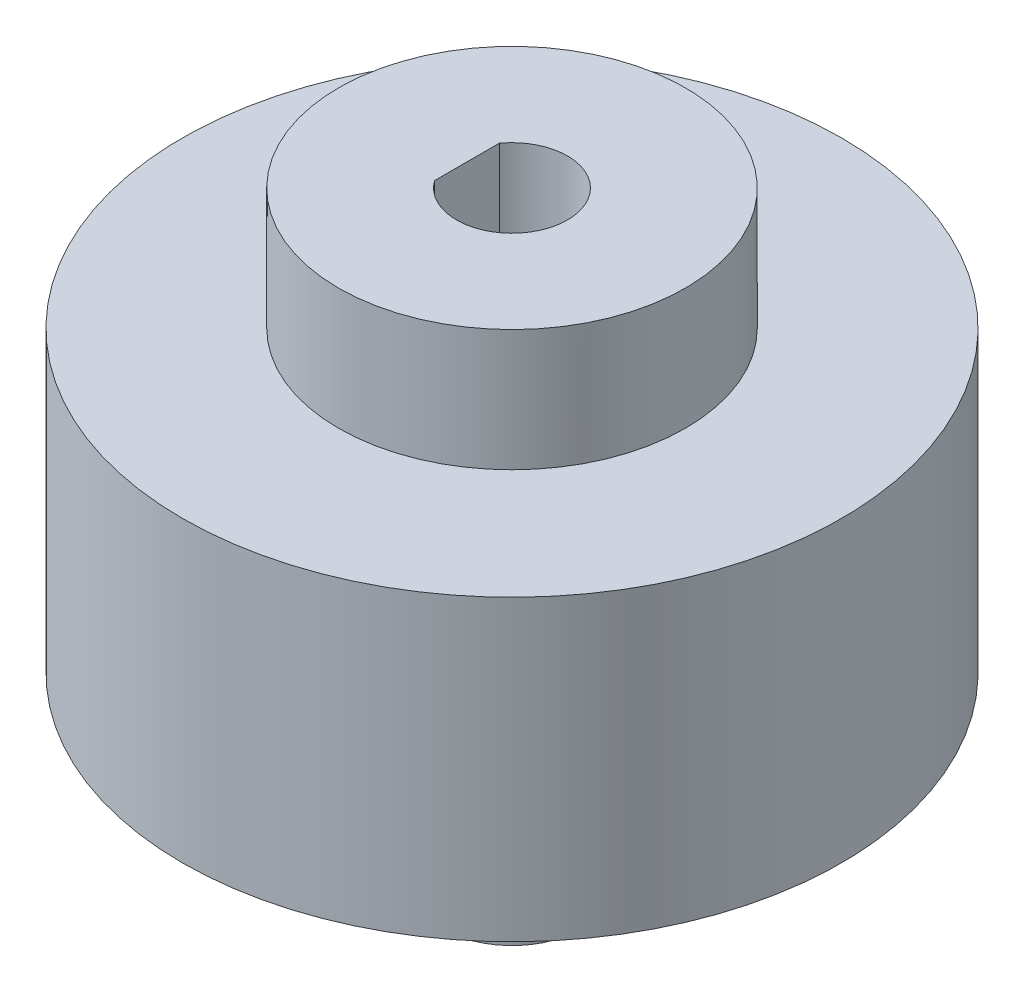
ISO-10303-21;
HEADER;
FILE_DESCRIPTION(('STEP AP214'),'2;1');
FILE_NAME('part.step','',(''),(''),'','','');
FILE_SCHEMA(('AUTOMOTIVE_DESIGN { 1 0 10303 214 1 1 1 1 }'));
ENDSEC;
DATA;
#1=APPLICATION_CONTEXT('core data for automotive mechanical design processes');
#2=APPLICATION_PROTOCOL_DEFINITION('international standard','automotive_design',2000,#1);
#3=PRODUCT_CONTEXT('',#1,'mechanical');
#4=PRODUCT('Part','Part','',(#3));
#5=PRODUCT_RELATED_PRODUCT_CATEGORY('part','',(#4));
#6=PRODUCT_DEFINITION_FORMATION('','',#4);
#7=PRODUCT_DEFINITION_CONTEXT('part definition',#1,'design');
#8=PRODUCT_DEFINITION('design','',#6,#7);
#9=PRODUCT_DEFINITION_SHAPE('','',#8);
#10=(LENGTH_UNIT() NAMED_UNIT(*) SI_UNIT(.MILLI.,.METRE.));
#11=(NAMED_UNIT(*) PLANE_ANGLE_UNIT() SI_UNIT($,.RADIAN.));
#12=(NAMED_UNIT(*) SI_UNIT($,.STERADIAN.) SOLID_ANGLE_UNIT());
#13=UNCERTAINTY_MEASURE_WITH_UNIT(LENGTH_MEASURE(1.E-05),#10,'distance_accuracy_value','');
#14=(GEOMETRIC_REPRESENTATION_CONTEXT(3) GLOBAL_UNCERTAINTY_ASSIGNED_CONTEXT((#13)) GLOBAL_UNIT_ASSIGNED_CONTEXT((#10,
#11,#12)) REPRESENTATION_CONTEXT('',''));
#15=CARTESIAN_POINT('',(0.,0.,0.));
#16=DIRECTION('',(0.,0.,1.));
#17=DIRECTION('',(1.,0.,0.));
#18=AXIS2_PLACEMENT_3D('',#15,#16,#17);
#19=CARTESIAN_POINT('',(0.,0.,0.));
#20=DIRECTION('',(0.,1.,0.));
#21=DIRECTION('',(0.,0.,1.));
#22=AXIS2_PLACEMENT_3D('',#19,#20,#21);
#23=PLANE('',#22);
#24=CARTESIAN_POINT('',(0.,0.,0.));
#25=DIRECTION('',(0.,1.,0.));
#26=DIRECTION('',(0.,0.,1.));
#27=AXIS2_PLACEMENT_3D('',#24,#25,#26);
#28=CIRCLE('',#27,3.2);
#29=CARTESIAN_POINT('',(-2.6,0.,1.86547581061776));
#30=VERTEX_POINT('',#29);
#31=CARTESIAN_POINT('',(-2.6,0.,-1.86547581061776));
#32=VERTEX_POINT('',#31);
#33=EDGE_CURVE('E71',#30,#32,#28,.T.);
#34=ORIENTED_EDGE('',*,*,#33,.F.);
#35=DIRECTION('',(0.,0.,1.));
#36=VECTOR('',#35,1.);
#37=CARTESIAN_POINT('',(-2.6,0.,0.));
#38=LINE('',#37,#36);
#39=EDGE_CURVE('E92',#32,#30,#38,.T.);
#40=ORIENTED_EDGE('',*,*,#39,.F.);
#41=EDGE_LOOP('',(#34,#40));
#42=FACE_BOUND('',#41,.T.);
#43=CARTESIAN_POINT('',(0.,0.,0.));
#44=DIRECTION('',(0.,1.,0.));
#45=DIRECTION('',(0.,0.,1.));
#46=AXIS2_PLACEMENT_3D('',#43,#44,#45);
#47=CIRCLE('',#46,10.);
#48=CARTESIAN_POINT('',(0.,0.,10.));
#49=VERTEX_POINT('',#48);
#50=EDGE_CURVE('E93',#49,#49,#47,.T.);
#51=ORIENTED_EDGE('',*,*,#50,.T.);
#52=EDGE_LOOP('',(#51));
#53=FACE_BOUND('',#52,.T.);
#54=ADVANCED_FACE('F47',(#42,#53),#23,.T.);
#55=CARTESIAN_POINT('',(0.,-13.,0.));
#56=DIRECTION('',(0.,1.,0.));
#57=DIRECTION('',(0.,0.,1.));
#58=AXIS2_PLACEMENT_3D('',#55,#56,#57);
#59=CYLINDRICAL_SURFACE('',#58,3.2);
#60=ORIENTED_EDGE('',*,*,#33,.T.);
#61=DIRECTION('',(0.,-1.,0.));
#62=VECTOR('',#61,1.);
#63=CARTESIAN_POINT('',(-2.6,0.,-1.86547581061776));
#64=LINE('',#63,#62);
#65=CARTESIAN_POINT('',(-2.6,-13.,-1.86547581061776));
#66=VERTEX_POINT('',#65);
#67=EDGE_CURVE('E85',#32,#66,#64,.T.);
#68=ORIENTED_EDGE('',*,*,#67,.T.);
#69=CARTESIAN_POINT('',(0.,-13.,0.));
#70=DIRECTION('',(0.,1.,0.));
#71=DIRECTION('',(0.,0.,1.));
#72=AXIS2_PLACEMENT_3D('',#69,#70,#71);
#73=CIRCLE('',#72,3.2);
#74=CARTESIAN_POINT('',(-2.6,-13.,1.86547581061776));
#75=VERTEX_POINT('',#74);
#76=EDGE_CURVE('E79',#75,#66,#73,.T.);
#77=ORIENTED_EDGE('',*,*,#76,.F.);
#78=DIRECTION('',(0.,-1.,0.));
#79=VECTOR('',#78,1.);
#80=CARTESIAN_POINT('',(-2.6,0.,1.86547581061776));
#81=LINE('',#80,#79);
#82=EDGE_CURVE('E67',#30,#75,#81,.T.);
#83=ORIENTED_EDGE('',*,*,#82,.F.);
#84=EDGE_LOOP('',(#60,#68,#77,#83));
#85=FACE_BOUND('',#84,.T.);
#86=ADVANCED_FACE('F86',(#85),#59,.F.);
#87=CARTESIAN_POINT('',(0.,-13.,0.));
#88=DIRECTION('',(0.,1.,0.));
#89=DIRECTION('',(0.,0.,1.));
#90=AXIS2_PLACEMENT_3D('',#87,#88,#89);
#91=PLANE('',#90);
#92=DIRECTION('',(0.,0.,1.));
#93=VECTOR('',#92,1.);
#94=CARTESIAN_POINT('',(-2.6,-13.,0.));
#95=LINE('',#94,#93);
#96=EDGE_CURVE('E82',#66,#75,#95,.T.);
#97=ORIENTED_EDGE('',*,*,#96,.T.);
#98=ORIENTED_EDGE('',*,*,#76,.T.);
#99=EDGE_LOOP('',(#97,#98));
#100=FACE_BOUND('',#99,.T.);
#101=ADVANCED_FACE('F80',(#100),#91,.T.);
#102=CARTESIAN_POINT('',(-2.6,0.,0.));
#103=DIRECTION('',(1.,0.,0.));
#104=DIRECTION('',(0.,0.,-1.));
#105=AXIS2_PLACEMENT_3D('',#102,#103,#104);
#106=PLANE('',#105);
#107=ORIENTED_EDGE('',*,*,#96,.F.);
#108=ORIENTED_EDGE('',*,*,#67,.F.);
#109=ORIENTED_EDGE('',*,*,#39,.T.);
#110=ORIENTED_EDGE('',*,*,#82,.T.);
#111=EDGE_LOOP('',(#107,#108,#109,#110));
#112=FACE_BOUND('',#111,.T.);
#113=ADVANCED_FACE('F91',(#112),#106,.T.);
#114=CARTESIAN_POINT('',(0.,-7.,0.));
#115=DIRECTION('',(0.,1.,0.));
#116=DIRECTION('',(0.,0.,1.));
#117=AXIS2_PLACEMENT_3D('',#114,#115,#116);
#118=CYLINDRICAL_SURFACE('',#117,10.);
#119=CARTESIAN_POINT('',(0.,-7.,0.));
#120=DIRECTION('',(0.,-1.,0.));
#121=DIRECTION('',(0.,0.,-1.));
#122=AXIS2_PLACEMENT_3D('',#119,#120,#121);
#123=CIRCLE('',#122,10.);
#124=CARTESIAN_POINT('',(0.,-7.,-10.));
#125=VERTEX_POINT('',#124);
#126=EDGE_CURVE('E97',#125,#125,#123,.F.);
#127=ORIENTED_EDGE('',*,*,#126,.T.);
#128=EDGE_LOOP('',(#127));
#129=FACE_BOUND('',#128,.T.);
#130=ORIENTED_EDGE('',*,*,#50,.F.);
#131=EDGE_LOOP('',(#130));
#132=FACE_BOUND('',#131,.T.);
#133=ADVANCED_FACE('F133',(#129,#132),#118,.T.);
#134=CARTESIAN_POINT('',(0.,-7.,0.));
#135=DIRECTION('',(0.,-1.,0.));
#136=DIRECTION('',(0.,0.,-1.));
#137=AXIS2_PLACEMENT_3D('',#134,#135,#136);
#138=PLANE('',#137);
#139=ORIENTED_EDGE('',*,*,#126,.F.);
#140=EDGE_LOOP('',(#139));
#141=FACE_BOUND('',#140,.T.);
#142=CARTESIAN_POINT('',(0.,-7.,0.));
#143=DIRECTION('',(0.,-1.,0.));
#144=DIRECTION('',(0.,0.,-1.));
#145=AXIS2_PLACEMENT_3D('',#142,#143,#144);
#146=CIRCLE('',#145,19.);
#147=CARTESIAN_POINT('',(0.,-7.,-19.));
#148=VERTEX_POINT('',#147);
#149=EDGE_CURVE('E238',#148,#148,#146,.T.);
#150=ORIENTED_EDGE('',*,*,#149,.F.);
#151=EDGE_LOOP('',(#150));
#152=FACE_BOUND('',#151,.T.);
#153=ADVANCED_FACE('F134',(#141,#152),#138,.F.);
#154=CARTESIAN_POINT('',(0.,-24.2,0.));
#155=DIRECTION('',(0.,1.,0.));
#156=DIRECTION('',(0.,0.,1.));
#157=AXIS2_PLACEMENT_3D('',#154,#155,#156);
#158=CYLINDRICAL_SURFACE('',#157,16.2);
#159=CARTESIAN_POINT('',(-3.,-16.6,-15.9197989937059));
#160=CARTESIAN_POINT('',(-2.99999355747732,-16.7669537954407,-15.9198022047369));
#161=CARTESIAN_POINT('',(-2.9860159403156,-16.9339916237496,-15.9224538186141));
#162=CARTESIAN_POINT('',(-2.93051090682567,-17.2633599348253,-15.9327609823407));
#163=CARTESIAN_POINT('',(-2.88895988265398,-17.4256862592773,-15.9404208200563));
#164=CARTESIAN_POINT('',(-2.77962553001961,-17.7408181148807,-15.9598478223478));
#165=CARTESIAN_POINT('',(-2.71186634334625,-17.8936322582694,-15.971611205945));
#166=CARTESIAN_POINT('',(-2.55210262533196,-18.1857132742647,-15.9979153890088));
#167=CARTESIAN_POINT('',(-2.46010008275877,-18.324981256828,-16.0124559606261));
#168=CARTESIAN_POINT('',(-2.25327039315579,-18.5877188368911,-16.0428733837621));
#169=CARTESIAN_POINT('',(-2.13820580886466,-18.7110000655336,-16.0587630525941));
#170=CARTESIAN_POINT('',(-1.88903146064627,-18.93662401653,-16.0899750250605));
#171=CARTESIAN_POINT('',(-1.75492046198647,-19.0389653803529,-16.1052972918304));
#172=CARTESIAN_POINT('',(-1.4702248351875,-19.2205246437418,-16.1337851773818));
#173=CARTESIAN_POINT('',(-1.31952527884798,-19.299565200722,-16.1469339374821));
#174=CARTESIAN_POINT('',(-1.00670212397873,-19.4311369311341,-16.1694499270784));
#175=CARTESIAN_POINT('',(-0.844579442799549,-19.4836702305107,-16.1788174598255));
#176=CARTESIAN_POINT('',(-0.515463476206911,-19.5601544567536,-16.1926250018502));
#177=CARTESIAN_POINT('',(-0.348546292760662,-19.5844228196304,-16.1971196962324));
#178=CARTESIAN_POINT('',(-0.0129530091873489,-19.6046771340743,-16.2008635474312));
#179=CARTESIAN_POINT('',(0.15572294351926,-19.6006654373535,-16.2001131404198));
#180=CARTESIAN_POINT('',(0.487869494205325,-19.5647174400773,-16.1934941386404));
#181=CARTESIAN_POINT('',(0.651378511237082,-19.5331229184591,-16.1876881894092));
#182=CARTESIAN_POINT('',(0.970733360599348,-19.4434463986606,-16.1716806715516));
#183=CARTESIAN_POINT('',(1.12657891852558,-19.3853634527775,-16.1614789456539));
#184=CARTESIAN_POINT('',(1.42717724925516,-19.2440315684291,-16.1377212053041));
#185=CARTESIAN_POINT('',(1.5718640580683,-19.1606455157664,-16.1241469902955));
#186=CARTESIAN_POINT('',(1.84531934837263,-18.9711754023029,-16.0951462604918));
#187=CARTESIAN_POINT('',(1.97408624729708,-18.8650890877718,-16.0797195618451));
#188=CARTESIAN_POINT('',(2.21407087919419,-18.6313450130219,-16.0484510047805));
#189=CARTESIAN_POINT('',(2.32499724063475,-18.5033882709861,-16.0326063881307));
#190=CARTESIAN_POINT('',(2.52385845031203,-18.2305328498616,-16.0025086968305));
#191=CARTESIAN_POINT('',(2.61179297824006,-18.0856339347853,-15.9882556443545));
#192=CARTESIAN_POINT('',(2.76225442089834,-17.7826266622488,-15.9629511350764));
#193=CARTESIAN_POINT('',(2.82473984161988,-17.6244972347435,-15.9519049152727));
#194=CARTESIAN_POINT('',(2.92217464781018,-17.2997341455501,-15.9343456311629));
#195=CARTESIAN_POINT('',(2.95712707088969,-17.1331014241587,-15.9278320667955));
#196=CARTESIAN_POINT('',(2.9980800657247,-16.7986868874172,-15.9201742741413));
#197=CARTESIAN_POINT('',(3.00449886903996,-16.630958013053,-15.918952488489));
#198=CARTESIAN_POINT('',(2.98932276964418,-16.2968248606094,-15.9218091582748));
#199=CARTESIAN_POINT('',(2.96772921649287,-16.1304205191061,-15.9258873583738));
#200=CARTESIAN_POINT('',(2.89750012628756,-15.8050295704116,-15.9388123131555));
#201=CARTESIAN_POINT('',(2.84908309661402,-15.6459941342812,-15.9476205190484));
#202=CARTESIAN_POINT('',(2.72681296691701,-15.3382930933951,-15.9689799127053));
#203=CARTESIAN_POINT('',(2.65295803241663,-15.1896282374531,-15.9815313704085));
#204=CARTESIAN_POINT('',(2.48094312589812,-14.9050436990069,-16.0091400700798));
#205=CARTESIAN_POINT('',(2.38251850623505,-14.7692866154562,-16.0242239688788));
#206=CARTESIAN_POINT('',(2.16451574765841,-14.516064039491,-16.0551226501072));
#207=CARTESIAN_POINT('',(2.04493575553374,-14.3986001512572,-16.0709374964778));
#208=CARTESIAN_POINT('',(1.7861504735088,-14.1837399521935,-16.1017649123033));
#209=CARTESIAN_POINT('',(1.64671006657765,-14.0866246473447,-16.1167643649588));
#210=CARTESIAN_POINT('',(1.35324993181201,-13.9171998351857,-16.1440514960635));
#211=CARTESIAN_POINT('',(1.19923075581216,-13.8448893894423,-16.1563392770962));
#212=CARTESIAN_POINT('',(0.881768314841834,-13.7275495346492,-16.1767620863005));
#213=CARTESIAN_POINT('',(0.718377864102461,-13.6823810758063,-16.1849182466033));
#214=CARTESIAN_POINT('',(0.386164920605944,-13.6201630966287,-16.1962488917699));
#215=CARTESIAN_POINT('',(0.217342986574603,-13.6031106934207,-16.1994238873745));
#216=CARTESIAN_POINT('',(-0.118243847955961,-13.5977072270098,-16.2004246539452));
#217=CARTESIAN_POINT('',(-0.285001821916212,-13.6089313895025,-16.1983295931088));
#218=CARTESIAN_POINT('',(-0.614212379314872,-13.6588334650974,-16.1891898213401));
#219=CARTESIAN_POINT('',(-0.776665001852551,-13.6975111287904,-16.1821451553739));
#220=CARTESIAN_POINT('',(-1.0924361303629,-13.8010451047287,-16.163897275679));
#221=CARTESIAN_POINT('',(-1.24576954766951,-13.8658572525502,-16.1527010801366));
#222=CARTESIAN_POINT('',(-1.53944890492344,-14.0197699554816,-16.1273633278497));
#223=CARTESIAN_POINT('',(-1.67979400268325,-14.1088720841244,-16.1132215803029));
#224=CARTESIAN_POINT('',(-1.94563231644097,-14.3103027393416,-16.0833044463411));
#225=CARTESIAN_POINT('',(-2.07089038427323,-14.4229386559201,-16.0675089796049));
#226=CARTESIAN_POINT('',(-2.30087510017368,-14.6676007286439,-16.0361927783877));
#227=CARTESIAN_POINT('',(-2.40559691661042,-14.799631435116,-16.0206721093388));
#228=CARTESIAN_POINT('',(-2.59241894180908,-15.0807541512503,-15.9915105510339));
#229=CARTESIAN_POINT('',(-2.6743073360987,-15.229988860859,-15.9778878138466));
#230=CARTESIAN_POINT('',(-2.81172069671606,-15.5402999413813,-15.95428242778));
#231=CARTESIAN_POINT('',(-2.86727071914869,-15.701364888819,-15.9442963214236));
#232=CARTESIAN_POINT('',(-2.93904960531601,-15.9857699482044,-15.9311926935832));
#233=CARTESIAN_POINT('',(-2.96186712844396,-16.1074378444433,-15.9269452374235));
#234=CARTESIAN_POINT('',(-2.99234451439745,-16.3527218266351,-15.921247234703));
#235=CARTESIAN_POINT('',(-3.00000477195579,-16.4763378617692,-15.9197966153056));
#236=CARTESIAN_POINT('',(-3.,-16.6,-15.9197989937059));
#237=B_SPLINE_CURVE_WITH_KNOTS('',3,(#159,#160,#161,#162,#163,#164,#165,#166,#167,#168,#169,
#170,#171,#172,#173,#174,#175,#176,#177,#178,#179,#180,#181,#182,#183,#184,#185,#186,#187,#188,
#189,#190,#191,#192,#193,#194,#195,#196,#197,#198,#199,#200,#201,#202,#203,#204,#205,#206,#207,
#208,#209,#210,#211,#212,#213,#214,#215,#216,#217,#218,#219,#220,#221,#222,#223,#224,#225,#226,
#227,#228,#229,#230,#231,#232,#233,#234,#235,#236),.UNSPECIFIED.,.T.,.F.,(4,2,2,2,2,2,2,2,2,2,2,
2,2,2,2,2,2,2,2,2,2,2,2,2,2,2,2,2,2,2,2,2,2,2,2,2,2,2,4),(0.,0.500408882999382,1.00124676060167,
1.50162438324691,2.00196097092774,2.50774113203242,3.01355409660964,3.52312290143734,
4.03265083114449,4.53639945927241,5.04010619718311,5.53765869536213,6.03522899637186,
6.53554523071505,7.03591116058342,7.54376298024895,8.05162187463022,8.56030553439533,
9.06893306516696,9.57008027010809,10.0712033320263,10.5683029634837,11.0654384512272,
11.5681790801467,12.0709637709834,12.5802906658033,13.0895982893182,13.5962739515548,
14.1028976586893,14.6019563172621,15.1010104420539,15.5992247307567,16.0974713020262,
16.6026857420979,17.1080189034024,17.6178946508299,18.1272843674117,18.4979452674077,
18.8685965143471),.UNSPECIFIED.);
#238=CARTESIAN_POINT('',(-3.,-16.6,-15.9197989937059));
#239=VERTEX_POINT('',#238);
#240=EDGE_CURVE('E233',#239,#239,#237,.T.);
#241=ORIENTED_EDGE('',*,*,#240,.F.);
#242=EDGE_LOOP('',(#241));
#243=FACE_BOUND('',#242,.T.);
#244=CARTESIAN_POINT('',(0.,-10.,0.));
#245=DIRECTION('',(0.,-1.,0.));
#246=DIRECTION('',(0.,0.,-1.));
#247=AXIS2_PLACEMENT_3D('',#244,#245,#246);
#248=CIRCLE('',#247,16.2);
#249=CARTESIAN_POINT('',(0.,-10.,-16.2));
#250=VERTEX_POINT('',#249);
#251=EDGE_CURVE('E247',#250,#250,#248,.F.);
#252=ORIENTED_EDGE('',*,*,#251,.T.);
#253=EDGE_LOOP('',(#252));
#254=FACE_BOUND('',#253,.T.);
#255=CARTESIAN_POINT('',(0.,-24.2,0.));
#256=DIRECTION('',(0.,-1.,0.));
#257=DIRECTION('',(0.,0.,-1.));
#258=AXIS2_PLACEMENT_3D('',#255,#256,#257);
#259=CIRCLE('',#258,16.2);
#260=CARTESIAN_POINT('',(0.,-24.2,-16.2));
#261=VERTEX_POINT('',#260);
#262=EDGE_CURVE('E239',#261,#261,#259,.T.);
#263=ORIENTED_EDGE('',*,*,#262,.T.);
#264=EDGE_LOOP('',(#263));
#265=FACE_BOUND('',#264,.T.);
#266=ADVANCED_FACE('F141',(#243,#254,#265),#158,.F.);
#267=CARTESIAN_POINT('',(0.,-24.2,0.));
#268=DIRECTION('',(0.,1.,0.));
#269=DIRECTION('',(0.,0.,1.));
#270=AXIS2_PLACEMENT_3D('',#267,#268,#269);
#271=CYLINDRICAL_SURFACE('',#270,19.);
#272=CARTESIAN_POINT('',(-3.,-16.6,-18.7616630392937));
#273=CARTESIAN_POINT('',(-2.99999316909988,-16.767380538029,-18.7616659476917));
#274=CARTESIAN_POINT('',(-2.9859444756721,-16.9348555885292,-18.7639271999941));
#275=CARTESIAN_POINT('',(-2.93014018262921,-17.2651156074321,-18.7727207890982));
#276=CARTESIAN_POINT('',(-2.88835823742514,-17.4278959624687,-18.7792571870474));
#277=CARTESIAN_POINT('',(-2.77837520534915,-17.7439387463532,-18.7958427079633));
#278=CARTESIAN_POINT('',(-2.71019522433027,-17.8972086657184,-18.8058890240425));
#279=CARTESIAN_POINT('',(-2.54940256061622,-18.1901138204754,-18.8283590905672));
#280=CARTESIAN_POINT('',(-2.4567929576144,-18.3297507714544,-18.8407825412875));
#281=CARTESIAN_POINT('',(-2.248894276728,-18.5926824881733,-18.8667300768076));
#282=CARTESIAN_POINT('',(-2.13343127642802,-18.7158389686266,-18.8802621040394));
#283=CARTESIAN_POINT('',(-1.88347909177738,-18.9411141491456,-18.9068313421108));
#284=CARTESIAN_POINT('',(-1.74898882502254,-19.0432316515545,-18.9198685247467));
#285=CARTESIAN_POINT('',(-1.46390909658435,-19.224044511929,-18.9440626919961));
#286=CARTESIAN_POINT('',(-1.31323750163672,-19.3026118859852,-18.9552092647771));
#287=CARTESIAN_POINT('',(-1.00063067392394,-19.4332723312506,-18.9742781305946));
#288=CARTESIAN_POINT('',(-0.838696099998688,-19.4853669495337,-18.9822006120424));
#289=CARTESIAN_POINT('',(-0.509586429007865,-19.5611821356265,-18.9938725961201));
#290=CARTESIAN_POINT('',(-0.342465993865004,-19.5851346536323,-18.9976561937446));
#291=CARTESIAN_POINT('',(-0.00653819787778306,-19.6047064189304,-19.0007410892385));
#292=CARTESIAN_POINT('',(0.16226905892066,-19.600327403118,-19.0000426618833));
#293=CARTESIAN_POINT('',(0.495194609697281,-19.5635424563587,-18.9942693267324));
#294=CARTESIAN_POINT('',(0.659341251787798,-19.5313861044812,-18.9892333925569));
#295=CARTESIAN_POINT('',(0.979879196630598,-19.4403516166589,-18.9753943064704));
#296=CARTESIAN_POINT('',(1.13627028242493,-19.3814727336312,-18.9665910492365));
#297=CARTESIAN_POINT('',(1.43760708043224,-19.2384124876942,-18.9461397402977));
#298=CARTESIAN_POINT('',(1.58250257635771,-19.154127085749,-18.9344800289721));
#299=CARTESIAN_POINT('',(1.85618769918793,-18.9627224329465,-18.9096134230095));
#300=CARTESIAN_POINT('',(1.98497615234847,-18.8556015195681,-18.8964064157544));
#301=CARTESIAN_POINT('',(2.2242641349846,-18.620179047772,-18.8697464007409));
#302=CARTESIAN_POINT('',(2.33454915610828,-18.4916594744605,-18.8562922804196));
#303=CARTESIAN_POINT('',(2.53202185925799,-18.2178257516658,-18.8307941892669));
#304=CARTESIAN_POINT('',(2.61920936831871,-18.0725114764275,-18.8187502289957));
#305=CARTESIAN_POINT('',(2.76804715045431,-17.7689781071258,-18.7974360112244));
#306=CARTESIAN_POINT('',(2.82967363595579,-17.6107471556822,-18.7881683396086));
#307=CARTESIAN_POINT('',(2.92541499568588,-17.2860011588186,-18.773500351968));
#308=CARTESIAN_POINT('',(2.95953203011892,-17.1194867649538,-18.7680997322832));
#309=CARTESIAN_POINT('',(2.99898822085886,-16.7848140886823,-18.7618354706712));
#310=CARTESIAN_POINT('',(3.00463224160405,-16.6166926175635,-18.7609237678475));
#311=CARTESIAN_POINT('',(2.9877927379622,-16.2819058821339,-18.7636127773814));
#312=CARTESIAN_POINT('',(2.96531018431278,-16.1152405677664,-18.7672133340066));
#313=CARTESIAN_POINT('',(2.89311492876814,-15.7890526612746,-18.7784769039498));
#314=CARTESIAN_POINT('',(2.84355562893464,-15.6294952565731,-18.7861170235178));
#315=CARTESIAN_POINT('',(2.71877386410381,-15.3209513185678,-18.8045798394508));
#316=CARTESIAN_POINT('',(2.6435500069826,-15.1719653592211,-18.8154027084535));
#317=CARTESIAN_POINT('',(2.4688479632725,-14.8874313693661,-18.8391240717815));
#318=CARTESIAN_POINT('',(2.36917334219688,-14.7520053487893,-18.8520390734044));
#319=CARTESIAN_POINT('',(2.14867064045927,-14.4996930228148,-18.8784404591888));
#320=CARTESIAN_POINT('',(2.0278412298225,-14.3828078839401,-18.8919268792343));
#321=CARTESIAN_POINT('',(1.76711250022556,-14.1697919241334,-18.9181025710778));
#322=CARTESIAN_POINT('',(1.62704664513586,-14.0738637324735,-18.930783285591));
#323=CARTESIAN_POINT('',(1.33261078975964,-13.9068999375413,-18.9537838609236));
#324=CARTESIAN_POINT('',(1.17824121469002,-13.8358635945912,-18.9641037918923));
#325=CARTESIAN_POINT('',(0.86019836151159,-13.721019839648,-18.9811826701041));
#326=CARTESIAN_POINT('',(0.696565089392224,-13.6771038362091,-18.9879558021439));
#327=CARTESIAN_POINT('',(0.364131082001045,-13.6173967240591,-18.997237676849));
#328=CARTESIAN_POINT('',(0.195330727499266,-13.6016035479858,-18.999746732974));
#329=CARTESIAN_POINT('',(-0.140684978112327,-13.5986450277613,-19.0002140180955));
#330=CARTESIAN_POINT('',(-0.307897619711348,-13.6111704523968,-18.9982214042513));
#331=CARTESIAN_POINT('',(-0.637806577187554,-13.663827980348,-18.9900089253266));
#332=CARTESIAN_POINT('',(-0.800502912283072,-13.7039599661703,-18.9837890782373));
#333=CARTESIAN_POINT('',(-1.11666063104877,-13.8105775227184,-18.9678180541085));
#334=CARTESIAN_POINT('',(-1.27013016894738,-13.8770394178987,-18.9580700502247));
#335=CARTESIAN_POINT('',(-1.56378774287446,-14.0343965738521,-18.936110364207));
#336=CARTESIAN_POINT('',(-1.70397525478576,-14.1252927982767,-18.9238985849104));
#337=CARTESIAN_POINT('',(-1.96865299857954,-14.3300465527214,-18.8982087619689));
#338=CARTESIAN_POINT('',(-2.09296612265599,-14.4441315686575,-18.8847189411562));
#339=CARTESIAN_POINT('',(-2.32079459945235,-14.6915460661354,-18.8580779385906));
#340=CARTESIAN_POINT('',(-2.42430507115168,-14.8248800515689,-18.8449268369425));
#341=CARTESIAN_POINT('',(-2.60818019485647,-15.1079968629441,-18.8203634543024));
#342=CARTESIAN_POINT('',(-2.68839545941796,-15.2578776985491,-18.8089626078222));
#343=CARTESIAN_POINT('',(-2.82239059117772,-15.5690995044238,-18.7893250794752));
#344=CARTESIAN_POINT('',(-2.87619742147506,-15.7304285924929,-18.7810851721647));
#345=CARTESIAN_POINT('',(-2.94387826509882,-16.0103657435891,-18.7705711730123));
#346=CARTESIAN_POINT('',(-2.96489100010251,-16.127259931973,-18.7672487289881));
#347=CARTESIAN_POINT('',(-2.99295418226227,-16.3627536012625,-18.7627936480009));
#348=CARTESIAN_POINT('',(-3.00000484205292,-16.4813530561702,-18.7616609776889));
#349=CARTESIAN_POINT('',(-3.,-16.6,-18.7616630392937));
#350=B_SPLINE_CURVE_WITH_KNOTS('',3,(#272,#273,#274,#275,#276,#277,#278,#279,#280,#281,#282,
#283,#284,#285,#286,#287,#288,#289,#290,#291,#292,#293,#294,#295,#296,#297,#298,#299,#300,#301,
#302,#303,#304,#305,#306,#307,#308,#309,#310,#311,#312,#313,#314,#315,#316,#317,#318,#319,#320,
#321,#322,#323,#324,#325,#326,#327,#328,#329,#330,#331,#332,#333,#334,#335,#336,#337,#338,#339,
#340,#341,#342,#343,#344,#345,#346,#347,#348,#349),.UNSPECIFIED.,.T.,.F.,(4,2,2,2,2,2,2,2,2,2,2,
2,2,2,2,2,2,2,2,2,2,2,2,2,2,2,2,2,2,2,2,2,2,2,2,2,2,2,4),(0.,0.501707854548428,1.00389299687931,
1.50567745668869,2.0073986897984,2.51309615784219,3.01882240507536,3.52724918335511,
4.03564624564335,4.53982297702354,5.04396879959932,5.54363144357725,6.04330805750094,
6.54505929164222,7.04684706786541,7.55410094671291,8.06135862401485,8.56908731147416,
9.07677612519699,9.57901733297179,10.0812412072818,10.5806488235211,11.0800835334613,
11.5836701888152,12.0872885153989,12.5955796124632,13.1038556040398,13.6100830041042,
14.1162731888972,14.6169626477838,15.1176499757492,15.6178881097004,16.118145975151,
16.6235713872649,17.1291152515335,17.6378328850319,18.1460300299999,18.5016688092061,
18.8573021721916),.UNSPECIFIED.);
#351=CARTESIAN_POINT('',(-3.,-16.6,-18.7616630392937));
#352=VERTEX_POINT('',#351);
#353=EDGE_CURVE('E12',#352,#352,#350,.T.);
#354=ORIENTED_EDGE('',*,*,#353,.T.);
#355=EDGE_LOOP('',(#354));
#356=FACE_BOUND('',#355,.T.);
#357=CARTESIAN_POINT('',(0.,-24.2,0.));
#358=DIRECTION('',(0.,-1.,0.));
#359=DIRECTION('',(0.,0.,-1.));
#360=AXIS2_PLACEMENT_3D('',#357,#358,#359);
#361=CIRCLE('',#360,19.);
#362=CARTESIAN_POINT('',(0.,-24.2,-19.));
#363=VERTEX_POINT('',#362);
#364=EDGE_CURVE('E244',#363,#363,#361,.T.);
#365=ORIENTED_EDGE('',*,*,#364,.F.);
#366=EDGE_LOOP('',(#365));
#367=FACE_BOUND('',#366,.T.);
#368=ORIENTED_EDGE('',*,*,#149,.T.);
#369=EDGE_LOOP('',(#368));
#370=FACE_BOUND('',#369,.T.);
#371=ADVANCED_FACE('F120',(#356,#367,#370),#271,.T.);
#372=CARTESIAN_POINT('',(0.,-24.2,0.));
#373=DIRECTION('',(0.,-1.,0.));
#374=DIRECTION('',(0.,0.,-1.));
#375=AXIS2_PLACEMENT_3D('',#372,#373,#374);
#376=PLANE('',#375);
#377=ORIENTED_EDGE('',*,*,#262,.F.);
#378=EDGE_LOOP('',(#377));
#379=FACE_BOUND('',#378,.T.);
#380=ORIENTED_EDGE('',*,*,#364,.T.);
#381=EDGE_LOOP('',(#380));
#382=FACE_BOUND('',#381,.T.);
#383=ADVANCED_FACE('F114',(#379,#382),#376,.T.);
#384=CARTESIAN_POINT('',(0.,-35.,0.));
#385=DIRECTION('',(0.,1.,0.));
#386=DIRECTION('',(0.,0.,1.));
#387=AXIS2_PLACEMENT_3D('',#384,#385,#386);
#388=PLANE('',#387);
#389=CARTESIAN_POINT('',(0.,-35.,0.));
#390=DIRECTION('',(0.,1.,0.));
#391=DIRECTION('',(0.,0.,1.));
#392=AXIS2_PLACEMENT_3D('',#389,#390,#391);
#393=CIRCLE('',#392,4.);
#394=CARTESIAN_POINT('',(0.,-35.,4.));
#395=VERTEX_POINT('',#394);
#396=EDGE_CURVE('E83',#395,#395,#393,.T.);
#397=ORIENTED_EDGE('',*,*,#396,.F.);
#398=EDGE_LOOP('',(#397));
#399=FACE_BOUND('',#398,.T.);
#400=ADVANCED_FACE('F110',(#399),#388,.F.);
#401=CARTESIAN_POINT('',(0.,-35.,0.));
#402=DIRECTION('',(0.,1.,0.));
#403=DIRECTION('',(0.,0.,1.));
#404=AXIS2_PLACEMENT_3D('',#401,#402,#403);
#405=CYLINDRICAL_SURFACE('',#404,4.);
#406=CARTESIAN_POINT('',(0.,-10.,0.));
#407=DIRECTION('',(0.,-1.,0.));
#408=DIRECTION('',(0.,0.,-1.));
#409=AXIS2_PLACEMENT_3D('',#406,#407,#408);
#410=CIRCLE('',#409,4.);
#411=CARTESIAN_POINT('',(0.,-10.,-4.));
#412=VERTEX_POINT('',#411);
#413=EDGE_CURVE('E60',#412,#412,#410,.F.);
#414=ORIENTED_EDGE('',*,*,#413,.F.);
#415=EDGE_LOOP('',(#414));
#416=FACE_BOUND('',#415,.T.);
#417=ORIENTED_EDGE('',*,*,#396,.T.);
#418=EDGE_LOOP('',(#417));
#419=FACE_BOUND('',#418,.T.);
#420=ADVANCED_FACE('F49',(#416,#419),#405,.T.);
#421=CARTESIAN_POINT('',(0.,-10.,0.));
#422=DIRECTION('',(0.,-1.,0.));
#423=DIRECTION('',(0.,0.,-1.));
#424=AXIS2_PLACEMENT_3D('',#421,#422,#423);
#425=PLANE('',#424);
#426=ORIENTED_EDGE('',*,*,#251,.F.);
#427=EDGE_LOOP('',(#426));
#428=FACE_BOUND('',#427,.T.);
#429=ORIENTED_EDGE('',*,*,#413,.T.);
#430=EDGE_LOOP('',(#429));
#431=FACE_BOUND('',#430,.T.);
#432=ADVANCED_FACE('F106',(#428,#431),#425,.T.);
#433=CARTESIAN_POINT('',(0.,-16.6,-9.));
#434=DIRECTION('',(0.,0.,-1.));
#435=DIRECTION('',(-1.,0.,0.));
#436=AXIS2_PLACEMENT_3D('',#433,#434,#435);
#437=CYLINDRICAL_SURFACE('',#436,3.);
#438=ORIENTED_EDGE('',*,*,#240,.T.);
#439=EDGE_LOOP('',(#438));
#440=FACE_BOUND('',#439,.T.);
#441=ORIENTED_EDGE('',*,*,#353,.F.);
#442=EDGE_LOOP('',(#441));
#443=FACE_BOUND('',#442,.T.);
#444=ADVANCED_FACE('F185',(#440,#443),#437,.F.);
#445=CLOSED_SHELL('',(#54,#86,#101,#113,#133,#153,#266,#371,#383,#400,#420,#432,#444));
#446=MANIFOLD_SOLID_BREP('B2',#445);
#447=ADVANCED_BREP_SHAPE_REPRESENTATION('',(#18,#446),#14);
#448=SHAPE_DEFINITION_REPRESENTATION(#9,#447);
ENDSEC;
END-ISO-10303-21;
